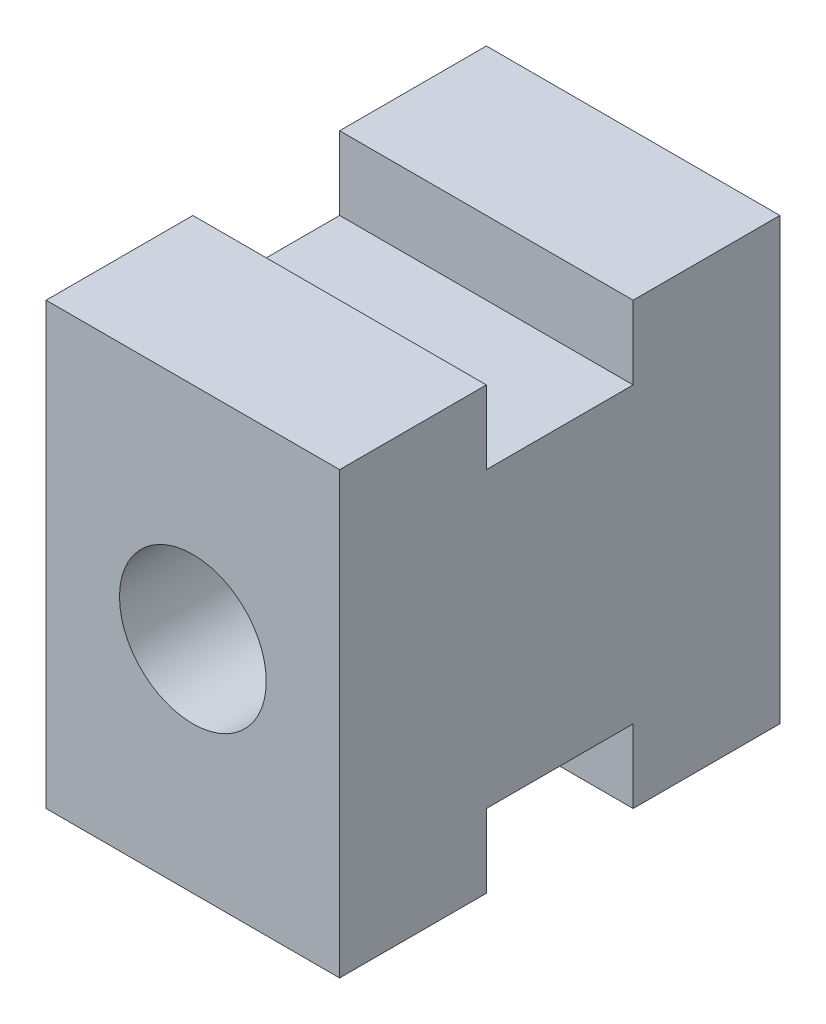
ISO-10303-21;
HEADER;
FILE_DESCRIPTION(('STEP AP214'),'2;1');
FILE_NAME('part.step','',(''),(''),'','','');
FILE_SCHEMA(('AUTOMOTIVE_DESIGN { 1 0 10303 214 1 1 1 1 }'));
ENDSEC;
DATA;
#1=APPLICATION_CONTEXT('core data for automotive mechanical design processes');
#2=APPLICATION_PROTOCOL_DEFINITION('international standard','automotive_design',2000,#1);
#3=PRODUCT_CONTEXT('',#1,'mechanical');
#4=PRODUCT('Part','Part','',(#3));
#5=PRODUCT_RELATED_PRODUCT_CATEGORY('part','',(#4));
#6=PRODUCT_DEFINITION_FORMATION('','',#4);
#7=PRODUCT_DEFINITION_CONTEXT('part definition',#1,'design');
#8=PRODUCT_DEFINITION('design','',#6,#7);
#9=PRODUCT_DEFINITION_SHAPE('','',#8);
#10=(LENGTH_UNIT() NAMED_UNIT(*) SI_UNIT(.MILLI.,.METRE.));
#11=(NAMED_UNIT(*) PLANE_ANGLE_UNIT() SI_UNIT($,.RADIAN.));
#12=(NAMED_UNIT(*) SI_UNIT($,.STERADIAN.) SOLID_ANGLE_UNIT());
#13=UNCERTAINTY_MEASURE_WITH_UNIT(LENGTH_MEASURE(1.E-05),#10,'distance_accuracy_value','');
#14=(GEOMETRIC_REPRESENTATION_CONTEXT(3) GLOBAL_UNCERTAINTY_ASSIGNED_CONTEXT((#13)) GLOBAL_UNIT_ASSIGNED_CONTEXT((#10,
#11,#12)) REPRESENTATION_CONTEXT('',''));
#15=CARTESIAN_POINT('',(0.,0.,0.));
#16=DIRECTION('',(0.,0.,1.));
#17=DIRECTION('',(1.,0.,0.));
#18=AXIS2_PLACEMENT_3D('',#15,#16,#17);
#19=CARTESIAN_POINT('',(-2.,3.,6.));
#20=DIRECTION('',(1.,0.,0.));
#21=DIRECTION('',(0.,1.,0.));
#22=AXIS2_PLACEMENT_3D('',#19,#20,#21);
#23=PLANE('',#22);
#24=DIRECTION('',(0.,0.,-1.));
#25=VECTOR('',#24,1.);
#26=CARTESIAN_POINT('',(-2.,3.,6.));
#27=LINE('',#26,#25);
#28=CARTESIAN_POINT('',(-2.,3.,6.));
#29=VERTEX_POINT('',#28);
#30=CARTESIAN_POINT('',(-2.,3.,4.));
#31=VERTEX_POINT('',#30);
#32=EDGE_CURVE('E146',#29,#31,#27,.T.);
#33=ORIENTED_EDGE('',*,*,#32,.T.);
#34=DIRECTION('',(0.,-1.,0.));
#35=VECTOR('',#34,1.);
#36=CARTESIAN_POINT('',(-2.,0.,4.));
#37=LINE('',#36,#35);
#38=CARTESIAN_POINT('',(-2.,2.,4.));
#39=VERTEX_POINT('',#38);
#40=EDGE_CURVE('E126',#31,#39,#37,.T.);
#41=ORIENTED_EDGE('',*,*,#40,.T.);
#42=DIRECTION('',(0.,0.,-1.));
#43=VECTOR('',#42,1.);
#44=CARTESIAN_POINT('',(-2.,2.,0.));
#45=LINE('',#44,#43);
#46=CARTESIAN_POINT('',(-2.,2.,2.));
#47=VERTEX_POINT('',#46);
#48=EDGE_CURVE('E138',#39,#47,#45,.T.);
#49=ORIENTED_EDGE('',*,*,#48,.T.);
#50=DIRECTION('',(0.,-1.,0.));
#51=VECTOR('',#50,1.);
#52=CARTESIAN_POINT('',(-2.,0.,2.));
#53=LINE('',#52,#51);
#54=CARTESIAN_POINT('',(-2.,3.,2.));
#55=VERTEX_POINT('',#54);
#56=EDGE_CURVE('E134',#55,#47,#53,.T.);
#57=ORIENTED_EDGE('',*,*,#56,.F.);
#58=CARTESIAN_POINT('',(-2.,3.,0.));
#59=VERTEX_POINT('',#58);
#60=EDGE_CURVE('E198',#55,#59,#27,.T.);
#61=ORIENTED_EDGE('',*,*,#60,.T.);
#62=DIRECTION('',(0.,-1.,0.));
#63=VECTOR('',#62,1.);
#64=CARTESIAN_POINT('',(-2.,3.,0.));
#65=LINE('',#64,#63);
#66=CARTESIAN_POINT('',(-2.,-3.,0.));
#67=VERTEX_POINT('',#66);
#68=EDGE_CURVE('E185',#59,#67,#65,.T.);
#69=ORIENTED_EDGE('',*,*,#68,.T.);
#70=DIRECTION('',(0.,0.,-1.));
#71=VECTOR('',#70,1.);
#72=CARTESIAN_POINT('',(-2.,-3.,6.));
#73=LINE('',#72,#71);
#74=CARTESIAN_POINT('',(-2.,-3.,2.));
#75=VERTEX_POINT('',#74);
#76=EDGE_CURVE('E41',#75,#67,#73,.T.);
#77=ORIENTED_EDGE('',*,*,#76,.F.);
#78=DIRECTION('',(0.,-1.,0.));
#79=VECTOR('',#78,1.);
#80=CARTESIAN_POINT('',(-2.,0.,2.));
#81=LINE('',#80,#79);
#82=CARTESIAN_POINT('',(-2.,-2.,2.));
#83=VERTEX_POINT('',#82);
#84=EDGE_CURVE('E167',#83,#75,#81,.T.);
#85=ORIENTED_EDGE('',*,*,#84,.F.);
#86=DIRECTION('',(0.,0.,-1.));
#87=VECTOR('',#86,1.);
#88=CARTESIAN_POINT('',(-2.,-2.,0.));
#89=LINE('',#88,#87);
#90=CARTESIAN_POINT('',(-2.,-2.,4.));
#91=VERTEX_POINT('',#90);
#92=EDGE_CURVE('E161',#91,#83,#89,.T.);
#93=ORIENTED_EDGE('',*,*,#92,.F.);
#94=DIRECTION('',(0.,-1.,0.));
#95=VECTOR('',#94,1.);
#96=CARTESIAN_POINT('',(-2.,0.,4.));
#97=LINE('',#96,#95);
#98=CARTESIAN_POINT('',(-2.,-3.,4.));
#99=VERTEX_POINT('',#98);
#100=EDGE_CURVE('E163',#91,#99,#97,.T.);
#101=ORIENTED_EDGE('',*,*,#100,.T.);
#102=CARTESIAN_POINT('',(-2.,-3.,6.));
#103=VERTEX_POINT('',#102);
#104=EDGE_CURVE('E11',#103,#99,#73,.T.);
#105=ORIENTED_EDGE('',*,*,#104,.F.);
#106=DIRECTION('',(0.,-1.,0.));
#107=VECTOR('',#106,1.);
#108=CARTESIAN_POINT('',(-2.,3.,6.));
#109=LINE('',#108,#107);
#110=EDGE_CURVE('E188',#29,#103,#109,.T.);
#111=ORIENTED_EDGE('',*,*,#110,.F.);
#112=EDGE_LOOP('',(#33,#41,#49,#57,#61,#69,#77,#85,#93,#101,#105,#111));
#113=FACE_BOUND('',#112,.T.);
#114=ADVANCED_FACE('F34',(#113),#23,.F.);
#115=CARTESIAN_POINT('',(2.,-3.,6.));
#116=DIRECTION('',(0.,1.,0.));
#117=DIRECTION('',(-1.,0.,0.));
#118=AXIS2_PLACEMENT_3D('',#115,#116,#117);
#119=PLANE('',#118);
#120=DIRECTION('',(1.,0.,0.));
#121=VECTOR('',#120,1.);
#122=CARTESIAN_POINT('',(-2.,-3.,2.));
#123=LINE('',#122,#121);
#124=CARTESIAN_POINT('',(2.,-3.,2.));
#125=VERTEX_POINT('',#124);
#126=EDGE_CURVE('E176',#75,#125,#123,.T.);
#127=ORIENTED_EDGE('',*,*,#126,.F.);
#128=ORIENTED_EDGE('',*,*,#76,.T.);
#129=DIRECTION('',(1.,0.,0.));
#130=VECTOR('',#129,1.);
#131=CARTESIAN_POINT('',(2.,-3.,0.));
#132=LINE('',#131,#130);
#133=CARTESIAN_POINT('',(2.,-3.,0.));
#134=VERTEX_POINT('',#133);
#135=EDGE_CURVE('E201',#67,#134,#132,.T.);
#136=ORIENTED_EDGE('',*,*,#135,.T.);
#137=DIRECTION('',(0.,0.,-1.));
#138=VECTOR('',#137,1.);
#139=CARTESIAN_POINT('',(2.,-3.,6.));
#140=LINE('',#139,#138);
#141=EDGE_CURVE('E213',#125,#134,#140,.T.);
#142=ORIENTED_EDGE('',*,*,#141,.F.);
#143=EDGE_LOOP('',(#127,#128,#136,#142));
#144=FACE_BOUND('',#143,.T.);
#145=ADVANCED_FACE('F228',(#144),#119,.F.);
#146=CARTESIAN_POINT('',(2.,3.,6.));
#147=DIRECTION('',(-1.,0.,0.));
#148=DIRECTION('',(0.,-1.,0.));
#149=AXIS2_PLACEMENT_3D('',#146,#147,#148);
#150=PLANE('',#149);
#151=DIRECTION('',(0.,0.,-1.));
#152=VECTOR('',#151,1.);
#153=CARTESIAN_POINT('',(2.,2.,0.));
#154=LINE('',#153,#152);
#155=CARTESIAN_POINT('',(2.,2.,4.));
#156=VERTEX_POINT('',#155);
#157=CARTESIAN_POINT('',(2.,2.,2.));
#158=VERTEX_POINT('',#157);
#159=EDGE_CURVE('E148',#156,#158,#154,.T.);
#160=ORIENTED_EDGE('',*,*,#159,.F.);
#161=DIRECTION('',(0.,-1.,0.));
#162=VECTOR('',#161,1.);
#163=CARTESIAN_POINT('',(2.,0.,4.));
#164=LINE('',#163,#162);
#165=CARTESIAN_POINT('',(2.,3.,4.));
#166=VERTEX_POINT('',#165);
#167=EDGE_CURVE('E129',#166,#156,#164,.T.);
#168=ORIENTED_EDGE('',*,*,#167,.F.);
#169=DIRECTION('',(0.,0.,-1.));
#170=VECTOR('',#169,1.);
#171=CARTESIAN_POINT('',(2.,3.,6.));
#172=LINE('',#171,#170);
#173=CARTESIAN_POINT('',(2.,3.,6.));
#174=VERTEX_POINT('',#173);
#175=EDGE_CURVE('E211',#174,#166,#172,.T.);
#176=ORIENTED_EDGE('',*,*,#175,.F.);
#177=DIRECTION('',(0.,1.,0.));
#178=VECTOR('',#177,1.);
#179=CARTESIAN_POINT('',(2.,3.,6.));
#180=LINE('',#179,#178);
#181=CARTESIAN_POINT('',(2.,-3.,6.));
#182=VERTEX_POINT('',#181);
#183=EDGE_CURVE('E194',#182,#174,#180,.T.);
#184=ORIENTED_EDGE('',*,*,#183,.F.);
#185=CARTESIAN_POINT('',(2.,-3.,4.));
#186=VERTEX_POINT('',#185);
#187=EDGE_CURVE('E214',#182,#186,#140,.T.);
#188=ORIENTED_EDGE('',*,*,#187,.T.);
#189=DIRECTION('',(0.,-1.,0.));
#190=VECTOR('',#189,1.);
#191=CARTESIAN_POINT('',(2.,0.,4.));
#192=LINE('',#191,#190);
#193=CARTESIAN_POINT('',(2.,-2.,4.));
#194=VERTEX_POINT('',#193);
#195=EDGE_CURVE('E171',#194,#186,#192,.T.);
#196=ORIENTED_EDGE('',*,*,#195,.F.);
#197=DIRECTION('',(0.,0.,-1.));
#198=VECTOR('',#197,1.);
#199=CARTESIAN_POINT('',(2.,-2.,0.));
#200=LINE('',#199,#198);
#201=CARTESIAN_POINT('',(2.,-2.,2.));
#202=VERTEX_POINT('',#201);
#203=EDGE_CURVE('E48',#194,#202,#200,.T.);
#204=ORIENTED_EDGE('',*,*,#203,.T.);
#205=DIRECTION('',(0.,-1.,0.));
#206=VECTOR('',#205,1.);
#207=CARTESIAN_POINT('',(2.,0.,2.));
#208=LINE('',#207,#206);
#209=EDGE_CURVE('E164',#202,#125,#208,.T.);
#210=ORIENTED_EDGE('',*,*,#209,.T.);
#211=ORIENTED_EDGE('',*,*,#141,.T.);
#212=DIRECTION('',(0.,1.,0.));
#213=VECTOR('',#212,1.);
#214=CARTESIAN_POINT('',(2.,3.,0.));
#215=LINE('',#214,#213);
#216=CARTESIAN_POINT('',(2.,3.,0.));
#217=VERTEX_POINT('',#216);
#218=EDGE_CURVE('E204',#134,#217,#215,.T.);
#219=ORIENTED_EDGE('',*,*,#218,.T.);
#220=CARTESIAN_POINT('',(2.,3.,2.));
#221=VERTEX_POINT('',#220);
#222=EDGE_CURVE('E210',#221,#217,#172,.T.);
#223=ORIENTED_EDGE('',*,*,#222,.F.);
#224=DIRECTION('',(0.,-1.,0.));
#225=VECTOR('',#224,1.);
#226=CARTESIAN_POINT('',(2.,0.,2.));
#227=LINE('',#226,#225);
#228=EDGE_CURVE('E56',#221,#158,#227,.T.);
#229=ORIENTED_EDGE('',*,*,#228,.T.);
#230=EDGE_LOOP('',(#160,#168,#176,#184,#188,#196,#204,#210,#211,#219,#223,#229));
#231=FACE_BOUND('',#230,.T.);
#232=ADVANCED_FACE('F221',(#231),#150,.F.);
#233=CARTESIAN_POINT('',(2.,3.,6.));
#234=DIRECTION('',(0.,-1.,0.));
#235=DIRECTION('',(1.,0.,0.));
#236=AXIS2_PLACEMENT_3D('',#233,#234,#235);
#237=PLANE('',#236);
#238=DIRECTION('',(1.,0.,0.));
#239=VECTOR('',#238,1.);
#240=CARTESIAN_POINT('',(-2.,3.,2.));
#241=LINE('',#240,#239);
#242=EDGE_CURVE('E158',#55,#221,#241,.T.);
#243=ORIENTED_EDGE('',*,*,#242,.T.);
#244=ORIENTED_EDGE('',*,*,#222,.T.);
#245=DIRECTION('',(-1.,0.,0.));
#246=VECTOR('',#245,1.);
#247=CARTESIAN_POINT('',(2.,3.,0.));
#248=LINE('',#247,#246);
#249=EDGE_CURVE('E192',#217,#59,#248,.T.);
#250=ORIENTED_EDGE('',*,*,#249,.T.);
#251=ORIENTED_EDGE('',*,*,#60,.F.);
#252=EDGE_LOOP('',(#243,#244,#250,#251));
#253=FACE_BOUND('',#252,.T.);
#254=ADVANCED_FACE('F236',(#253),#237,.F.);
#255=CARTESIAN_POINT('',(0.,0.,6.));
#256=DIRECTION('',(0.,0.,-1.));
#257=DIRECTION('',(-1.,0.,0.));
#258=AXIS2_PLACEMENT_3D('',#255,#256,#257);
#259=PLANE('',#258);
#260=ORIENTED_EDGE('',*,*,#110,.T.);
#261=DIRECTION('',(1.,0.,0.));
#262=VECTOR('',#261,1.);
#263=CARTESIAN_POINT('',(2.,-3.,6.));
#264=LINE('',#263,#262);
#265=EDGE_CURVE('E191',#103,#182,#264,.T.);
#266=ORIENTED_EDGE('',*,*,#265,.T.);
#267=ORIENTED_EDGE('',*,*,#183,.T.);
#268=DIRECTION('',(-1.,0.,0.));
#269=VECTOR('',#268,1.);
#270=CARTESIAN_POINT('',(2.,3.,6.));
#271=LINE('',#270,#269);
#272=EDGE_CURVE('E196',#174,#29,#271,.T.);
#273=ORIENTED_EDGE('',*,*,#272,.T.);
#274=EDGE_LOOP('',(#260,#266,#267,#273));
#275=FACE_BOUND('',#274,.T.);
#276=CARTESIAN_POINT('',(0.,0.,6.));
#277=DIRECTION('',(0.,0.,1.));
#278=DIRECTION('',(1.,0.,0.));
#279=AXIS2_PLACEMENT_3D('',#276,#277,#278);
#280=CIRCLE('',#279,1.);
#281=CARTESIAN_POINT('',(1.,0.,6.));
#282=VERTEX_POINT('',#281);
#283=EDGE_CURVE('E182',#282,#282,#280,.T.);
#284=ORIENTED_EDGE('',*,*,#283,.F.);
#285=EDGE_LOOP('',(#284));
#286=FACE_BOUND('',#285,.T.);
#287=ADVANCED_FACE('F242',(#275,#286),#259,.F.);
#288=CARTESIAN_POINT('',(0.,0.,0.));
#289=DIRECTION('',(0.,0.,-1.));
#290=DIRECTION('',(-1.,0.,0.));
#291=AXIS2_PLACEMENT_3D('',#288,#289,#290);
#292=PLANE('',#291);
#293=ORIENTED_EDGE('',*,*,#68,.F.);
#294=ORIENTED_EDGE('',*,*,#249,.F.);
#295=ORIENTED_EDGE('',*,*,#218,.F.);
#296=ORIENTED_EDGE('',*,*,#135,.F.);
#297=EDGE_LOOP('',(#293,#294,#295,#296));
#298=FACE_BOUND('',#297,.T.);
#299=CARTESIAN_POINT('',(0.,0.,0.));
#300=DIRECTION('',(0.,0.,1.));
#301=DIRECTION('',(1.,0.,0.));
#302=AXIS2_PLACEMENT_3D('',#299,#300,#301);
#303=CIRCLE('',#302,1.);
#304=CARTESIAN_POINT('',(1.,0.,0.));
#305=VERTEX_POINT('',#304);
#306=EDGE_CURVE('E157',#305,#305,#303,.T.);
#307=ORIENTED_EDGE('',*,*,#306,.T.);
#308=EDGE_LOOP('',(#307));
#309=FACE_BOUND('',#308,.T.);
#310=ADVANCED_FACE('F232',(#298,#309),#292,.T.);
#311=ORIENTED_EDGE('',*,*,#104,.T.);
#312=DIRECTION('',(1.,0.,0.));
#313=VECTOR('',#312,1.);
#314=CARTESIAN_POINT('',(-2.,-3.,4.));
#315=LINE('',#314,#313);
#316=EDGE_CURVE('E178',#99,#186,#315,.T.);
#317=ORIENTED_EDGE('',*,*,#316,.T.);
#318=ORIENTED_EDGE('',*,*,#187,.F.);
#319=ORIENTED_EDGE('',*,*,#265,.F.);
#320=EDGE_LOOP('',(#311,#317,#318,#319));
#321=FACE_BOUND('',#320,.T.);
#322=ADVANCED_FACE('F246',(#321),#119,.F.);
#323=ORIENTED_EDGE('',*,*,#175,.T.);
#324=DIRECTION('',(1.,0.,0.));
#325=VECTOR('',#324,1.);
#326=CARTESIAN_POINT('',(-2.,3.,4.));
#327=LINE('',#326,#325);
#328=EDGE_CURVE('E155',#31,#166,#327,.T.);
#329=ORIENTED_EDGE('',*,*,#328,.F.);
#330=ORIENTED_EDGE('',*,*,#32,.F.);
#331=ORIENTED_EDGE('',*,*,#272,.F.);
#332=EDGE_LOOP('',(#323,#329,#330,#331));
#333=FACE_BOUND('',#332,.T.);
#334=ADVANCED_FACE('F240',(#333),#237,.F.);
#335=CARTESIAN_POINT('',(0.,0.,6.));
#336=DIRECTION('',(0.,0.,-1.));
#337=DIRECTION('',(-1.,0.,0.));
#338=AXIS2_PLACEMENT_3D('',#335,#336,#337);
#339=CYLINDRICAL_SURFACE('',#338,1.);
#340=ORIENTED_EDGE('',*,*,#283,.T.);
#341=EDGE_LOOP('',(#340));
#342=FACE_BOUND('',#341,.T.);
#343=ORIENTED_EDGE('',*,*,#306,.F.);
#344=EDGE_LOOP('',(#343));
#345=FACE_BOUND('',#344,.T.);
#346=ADVANCED_FACE('F264',(#342,#345),#339,.F.);
#347=CARTESIAN_POINT('',(-2.,0.,4.));
#348=DIRECTION('',(0.,0.,1.));
#349=DIRECTION('',(0.,-1.,0.));
#350=AXIS2_PLACEMENT_3D('',#347,#348,#349);
#351=PLANE('',#350);
#352=ORIENTED_EDGE('',*,*,#167,.T.);
#353=DIRECTION('',(1.,0.,0.));
#354=VECTOR('',#353,1.);
#355=CARTESIAN_POINT('',(-2.,2.,4.));
#356=LINE('',#355,#354);
#357=EDGE_CURVE('E122',#39,#156,#356,.T.);
#358=ORIENTED_EDGE('',*,*,#357,.F.);
#359=ORIENTED_EDGE('',*,*,#40,.F.);
#360=ORIENTED_EDGE('',*,*,#328,.T.);
#361=EDGE_LOOP('',(#352,#358,#359,#360));
#362=FACE_BOUND('',#361,.T.);
#363=ADVANCED_FACE('F124',(#362),#351,.F.);
#364=CARTESIAN_POINT('',(-2.,0.,2.));
#365=DIRECTION('',(0.,0.,1.));
#366=DIRECTION('',(0.,-1.,0.));
#367=AXIS2_PLACEMENT_3D('',#364,#365,#366);
#368=PLANE('',#367);
#369=ORIENTED_EDGE('',*,*,#228,.F.);
#370=ORIENTED_EDGE('',*,*,#242,.F.);
#371=ORIENTED_EDGE('',*,*,#56,.T.);
#372=DIRECTION('',(1.,0.,0.));
#373=VECTOR('',#372,1.);
#374=CARTESIAN_POINT('',(-2.,2.,2.));
#375=LINE('',#374,#373);
#376=EDGE_CURVE('E133',#47,#158,#375,.T.);
#377=ORIENTED_EDGE('',*,*,#376,.T.);
#378=EDGE_LOOP('',(#369,#370,#371,#377));
#379=FACE_BOUND('',#378,.T.);
#380=ADVANCED_FACE('F256',(#379),#368,.T.);
#381=CARTESIAN_POINT('',(-2.,2.,0.));
#382=DIRECTION('',(0.,-1.,0.));
#383=DIRECTION('',(1.,0.,0.));
#384=AXIS2_PLACEMENT_3D('',#381,#382,#383);
#385=PLANE('',#384);
#386=ORIENTED_EDGE('',*,*,#159,.T.);
#387=ORIENTED_EDGE('',*,*,#376,.F.);
#388=ORIENTED_EDGE('',*,*,#48,.F.);
#389=ORIENTED_EDGE('',*,*,#357,.T.);
#390=EDGE_LOOP('',(#386,#387,#388,#389));
#391=FACE_BOUND('',#390,.T.);
#392=ADVANCED_FACE('F139',(#391),#385,.F.);
#393=CARTESIAN_POINT('',(-2.,-2.,0.));
#394=DIRECTION('',(0.,-1.,0.));
#395=DIRECTION('',(1.,0.,0.));
#396=AXIS2_PLACEMENT_3D('',#393,#394,#395);
#397=PLANE('',#396);
#398=ORIENTED_EDGE('',*,*,#203,.F.);
#399=DIRECTION('',(1.,0.,0.));
#400=VECTOR('',#399,1.);
#401=CARTESIAN_POINT('',(-2.,-2.,4.));
#402=LINE('',#401,#400);
#403=EDGE_CURVE('E169',#91,#194,#402,.T.);
#404=ORIENTED_EDGE('',*,*,#403,.F.);
#405=ORIENTED_EDGE('',*,*,#92,.T.);
#406=DIRECTION('',(1.,0.,0.));
#407=VECTOR('',#406,1.);
#408=CARTESIAN_POINT('',(-2.,-2.,2.));
#409=LINE('',#408,#407);
#410=EDGE_CURVE('E153',#83,#202,#409,.T.);
#411=ORIENTED_EDGE('',*,*,#410,.T.);
#412=EDGE_LOOP('',(#398,#404,#405,#411));
#413=FACE_BOUND('',#412,.T.);
#414=ADVANCED_FACE('F253',(#413),#397,.T.);
#415=CARTESIAN_POINT('',(-2.,0.,2.));
#416=DIRECTION('',(0.,0.,1.));
#417=DIRECTION('',(0.,-1.,0.));
#418=AXIS2_PLACEMENT_3D('',#415,#416,#417);
#419=PLANE('',#418);
#420=ORIENTED_EDGE('',*,*,#209,.F.);
#421=ORIENTED_EDGE('',*,*,#410,.F.);
#422=ORIENTED_EDGE('',*,*,#84,.T.);
#423=ORIENTED_EDGE('',*,*,#126,.T.);
#424=EDGE_LOOP('',(#420,#421,#422,#423));
#425=FACE_BOUND('',#424,.T.);
#426=ADVANCED_FACE('F255',(#425),#419,.T.);
#427=CARTESIAN_POINT('',(-2.,0.,4.));
#428=DIRECTION('',(0.,0.,1.));
#429=DIRECTION('',(0.,-1.,0.));
#430=AXIS2_PLACEMENT_3D('',#427,#428,#429);
#431=PLANE('',#430);
#432=ORIENTED_EDGE('',*,*,#195,.T.);
#433=ORIENTED_EDGE('',*,*,#316,.F.);
#434=ORIENTED_EDGE('',*,*,#100,.F.);
#435=ORIENTED_EDGE('',*,*,#403,.T.);
#436=EDGE_LOOP('',(#432,#433,#434,#435));
#437=FACE_BOUND('',#436,.T.);
#438=ADVANCED_FACE('F249',(#437),#431,.F.);
#439=CLOSED_SHELL('',(#114,#145,#232,#254,#287,#310,#322,#334,#346,#363,#380,#392,#414,#426,#438));
#440=MANIFOLD_SOLID_BREP('B2',#439);
#441=ADVANCED_BREP_SHAPE_REPRESENTATION('',(#18,#440),#14);
#442=SHAPE_DEFINITION_REPRESENTATION(#9,#441);
ENDSEC;
END-ISO-10303-21;
